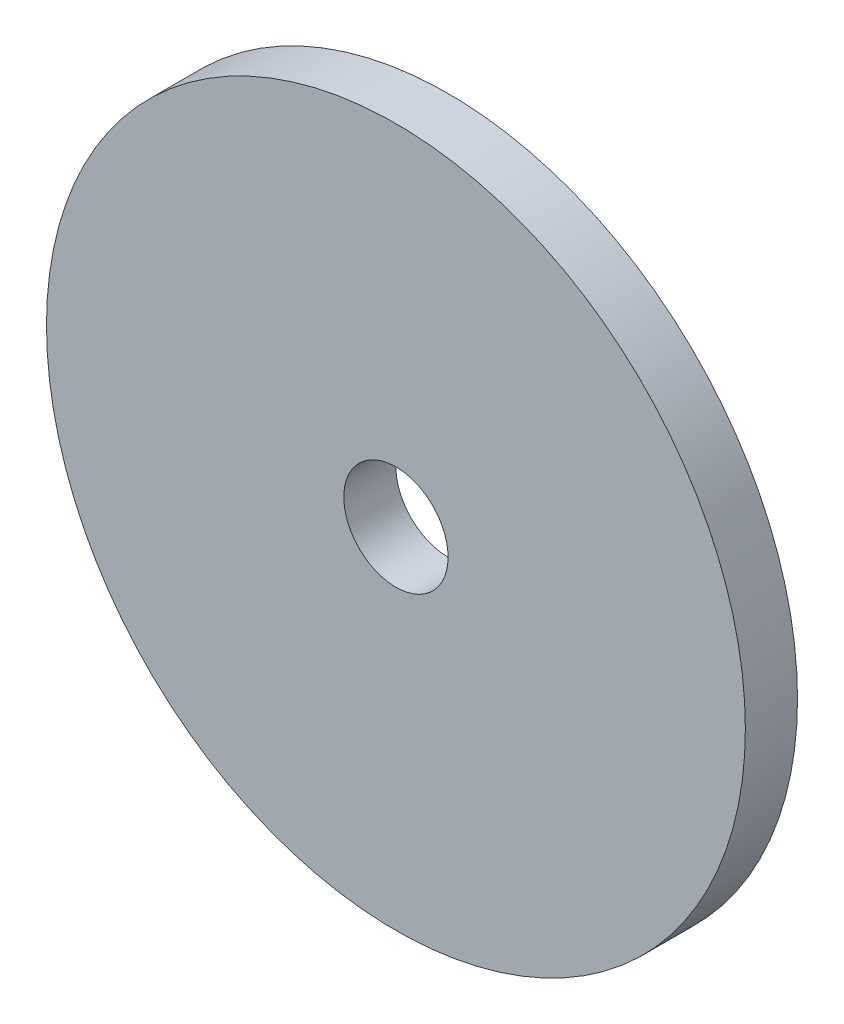
ISO-10303-21;
HEADER;
FILE_DESCRIPTION(('STEP AP214'),'2;1');
FILE_NAME('part.step','',(''),(''),'','','');
FILE_SCHEMA(('AUTOMOTIVE_DESIGN { 1 0 10303 214 1 1 1 1 }'));
ENDSEC;
DATA;
#1=APPLICATION_CONTEXT('core data for automotive mechanical design processes');
#2=APPLICATION_PROTOCOL_DEFINITION('international standard','automotive_design',2000,#1);
#3=PRODUCT_CONTEXT('',#1,'mechanical');
#4=PRODUCT('Part','Part','',(#3));
#5=PRODUCT_RELATED_PRODUCT_CATEGORY('part','',(#4));
#6=PRODUCT_DEFINITION_FORMATION('','',#4);
#7=PRODUCT_DEFINITION_CONTEXT('part definition',#1,'design');
#8=PRODUCT_DEFINITION('design','',#6,#7);
#9=PRODUCT_DEFINITION_SHAPE('','',#8);
#10=(LENGTH_UNIT() NAMED_UNIT(*) SI_UNIT(.MILLI.,.METRE.));
#11=(NAMED_UNIT(*) PLANE_ANGLE_UNIT() SI_UNIT($,.RADIAN.));
#12=(NAMED_UNIT(*) SI_UNIT($,.STERADIAN.) SOLID_ANGLE_UNIT());
#13=UNCERTAINTY_MEASURE_WITH_UNIT(LENGTH_MEASURE(1.E-05),#10,'distance_accuracy_value','');
#14=(GEOMETRIC_REPRESENTATION_CONTEXT(3) GLOBAL_UNCERTAINTY_ASSIGNED_CONTEXT((#13)) GLOBAL_UNIT_ASSIGNED_CONTEXT((#10,
#11,#12)) REPRESENTATION_CONTEXT('',''));
#15=CARTESIAN_POINT('',(0.,0.,0.));
#16=DIRECTION('',(0.,0.,1.));
#17=DIRECTION('',(1.,0.,0.));
#18=AXIS2_PLACEMENT_3D('',#15,#16,#17);
#19=CARTESIAN_POINT('',(0.,0.,5.));
#20=DIRECTION('',(0.,0.,-1.));
#21=DIRECTION('',(-1.,0.,0.));
#22=AXIS2_PLACEMENT_3D('',#19,#20,#21);
#23=CYLINDRICAL_SURFACE('',#22,33.5);
#24=CARTESIAN_POINT('',(0.,0.,5.));
#25=DIRECTION('',(0.,0.,1.));
#26=DIRECTION('',(1.,0.,0.));
#27=AXIS2_PLACEMENT_3D('',#24,#25,#26);
#28=CIRCLE('',#27,33.5);
#29=CARTESIAN_POINT('',(33.5,0.,5.));
#30=VERTEX_POINT('',#29);
#31=EDGE_CURVE('E10',#30,#30,#28,.T.);
#32=ORIENTED_EDGE('',*,*,#31,.F.);
#33=EDGE_LOOP('',(#32));
#34=FACE_BOUND('',#33,.T.);
#35=CARTESIAN_POINT('',(0.,0.,0.));
#36=DIRECTION('',(0.,0.,1.));
#37=DIRECTION('',(1.,0.,0.));
#38=AXIS2_PLACEMENT_3D('',#35,#36,#37);
#39=CIRCLE('',#38,33.5);
#40=CARTESIAN_POINT('',(33.5,0.,0.));
#41=VERTEX_POINT('',#40);
#42=EDGE_CURVE('E33',#41,#41,#39,.T.);
#43=ORIENTED_EDGE('',*,*,#42,.T.);
#44=EDGE_LOOP('',(#43));
#45=FACE_BOUND('',#44,.T.);
#46=ADVANCED_FACE('F30',(#34,#45),#23,.T.);
#47=CARTESIAN_POINT('',(0.,0.,5.));
#48=DIRECTION('',(0.,0.,1.));
#49=DIRECTION('',(1.,0.,0.));
#50=AXIS2_PLACEMENT_3D('',#47,#48,#49);
#51=PLANE('',#50);
#52=CARTESIAN_POINT('',(0.,0.,5.));
#53=DIRECTION('',(0.,0.,1.));
#54=DIRECTION('',(1.,0.,0.));
#55=AXIS2_PLACEMENT_3D('',#52,#53,#54);
#56=CIRCLE('',#55,5.);
#57=CARTESIAN_POINT('',(5.,0.,5.));
#58=VERTEX_POINT('',#57);
#59=EDGE_CURVE('E42',#58,#58,#56,.T.);
#60=ORIENTED_EDGE('',*,*,#59,.F.);
#61=EDGE_LOOP('',(#60));
#62=FACE_BOUND('',#61,.T.);
#63=ORIENTED_EDGE('',*,*,#31,.T.);
#64=EDGE_LOOP('',(#63));
#65=FACE_BOUND('',#64,.T.);
#66=ADVANCED_FACE('F57',(#62,#65),#51,.T.);
#67=CARTESIAN_POINT('',(0.,0.,0.));
#68=DIRECTION('',(0.,0.,1.));
#69=DIRECTION('',(1.,0.,0.));
#70=AXIS2_PLACEMENT_3D('',#67,#68,#69);
#71=PLANE('',#70);
#72=CARTESIAN_POINT('',(0.,0.,0.));
#73=DIRECTION('',(0.,0.,1.));
#74=DIRECTION('',(1.,0.,0.));
#75=AXIS2_PLACEMENT_3D('',#72,#73,#74);
#76=CIRCLE('',#75,5.);
#77=CARTESIAN_POINT('',(5.,0.,0.));
#78=VERTEX_POINT('',#77);
#79=EDGE_CURVE('E40',#78,#78,#76,.T.);
#80=ORIENTED_EDGE('',*,*,#79,.T.);
#81=EDGE_LOOP('',(#80));
#82=FACE_BOUND('',#81,.T.);
#83=ORIENTED_EDGE('',*,*,#42,.F.);
#84=EDGE_LOOP('',(#83));
#85=FACE_BOUND('',#84,.T.);
#86=ADVANCED_FACE('F48',(#82,#85),#71,.F.);
#87=CARTESIAN_POINT('',(0.,0.,0.));
#88=DIRECTION('',(0.,0.,1.));
#89=DIRECTION('',(1.,0.,0.));
#90=AXIS2_PLACEMENT_3D('',#87,#88,#89);
#91=CYLINDRICAL_SURFACE('',#90,5.);
#92=ORIENTED_EDGE('',*,*,#79,.F.);
#93=EDGE_LOOP('',(#92));
#94=FACE_BOUND('',#93,.T.);
#95=ORIENTED_EDGE('',*,*,#59,.T.);
#96=EDGE_LOOP('',(#95));
#97=FACE_BOUND('',#96,.T.);
#98=ADVANCED_FACE('F51',(#94,#97),#91,.F.);
#99=CLOSED_SHELL('',(#46,#66,#86,#98));
#100=MANIFOLD_SOLID_BREP('B2',#99);
#101=ADVANCED_BREP_SHAPE_REPRESENTATION('',(#18,#100),#14);
#102=SHAPE_DEFINITION_REPRESENTATION(#9,#101);
ENDSEC;
END-ISO-10303-21;
